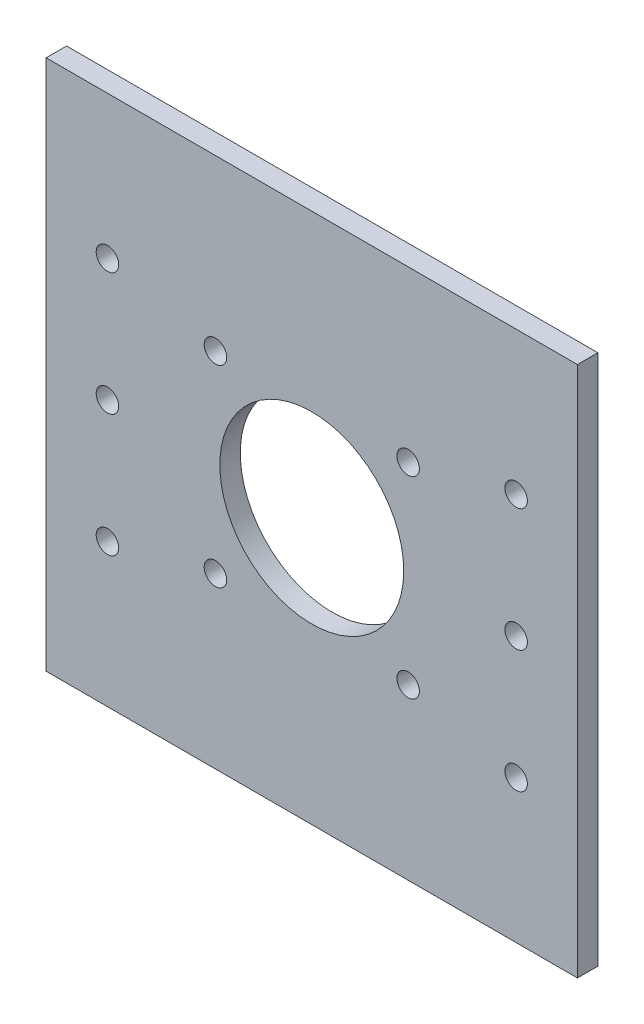
ISO-10303-21;
HEADER;
FILE_DESCRIPTION(('STEP AP214'),'2;1');
FILE_NAME('part.step','',(''),(''),'','','');
FILE_SCHEMA(('AUTOMOTIVE_DESIGN { 1 0 10303 214 1 1 1 1 }'));
ENDSEC;
DATA;
#1=APPLICATION_CONTEXT('core data for automotive mechanical design processes');
#2=APPLICATION_PROTOCOL_DEFINITION('international standard','automotive_design',2000,#1);
#3=PRODUCT_CONTEXT('',#1,'mechanical');
#4=PRODUCT('Part','Part','',(#3));
#5=PRODUCT_RELATED_PRODUCT_CATEGORY('part','',(#4));
#6=PRODUCT_DEFINITION_FORMATION('','',#4);
#7=PRODUCT_DEFINITION_CONTEXT('part definition',#1,'design');
#8=PRODUCT_DEFINITION('design','',#6,#7);
#9=PRODUCT_DEFINITION_SHAPE('','',#8);
#10=(LENGTH_UNIT() NAMED_UNIT(*) SI_UNIT(.MILLI.,.METRE.));
#11=(NAMED_UNIT(*) PLANE_ANGLE_UNIT() SI_UNIT($,.RADIAN.));
#12=(NAMED_UNIT(*) SI_UNIT($,.STERADIAN.) SOLID_ANGLE_UNIT());
#13=UNCERTAINTY_MEASURE_WITH_UNIT(LENGTH_MEASURE(1.E-05),#10,'distance_accuracy_value','');
#14=(GEOMETRIC_REPRESENTATION_CONTEXT(3) GLOBAL_UNCERTAINTY_ASSIGNED_CONTEXT((#13)) GLOBAL_UNIT_ASSIGNED_CONTEXT((#10,
#11,#12)) REPRESENTATION_CONTEXT('',''));
#15=CARTESIAN_POINT('',(0.,0.,0.));
#16=DIRECTION('',(0.,0.,1.));
#17=DIRECTION('',(1.,0.,0.));
#18=AXIS2_PLACEMENT_3D('',#15,#16,#17);
#19=CARTESIAN_POINT('',(0.,0.,5.));
#20=DIRECTION('',(0.,0.,1.));
#21=DIRECTION('',(1.,0.,0.));
#22=AXIS2_PLACEMENT_3D('',#19,#20,#21);
#23=PLANE('',#22);
#24=CARTESIAN_POINT('',(50.,0.,5.));
#25=DIRECTION('',(0.,0.,1.));
#26=DIRECTION('',(-1.,0.,0.));
#27=AXIS2_PLACEMENT_3D('',#24,#25,#26);
#28=CIRCLE('',#27,2.75);
#29=CARTESIAN_POINT('',(47.25,0.,5.));
#30=VERTEX_POINT('',#29);
#31=EDGE_CURVE('E197',#30,#30,#28,.T.);
#32=ORIENTED_EDGE('',*,*,#31,.F.);
#33=EDGE_LOOP('',(#32));
#34=FACE_BOUND('',#33,.T.);
#35=CARTESIAN_POINT('',(-50.,-30.,5.));
#36=DIRECTION('',(0.,0.,1.));
#37=DIRECTION('',(-1.,0.,0.));
#38=AXIS2_PLACEMENT_3D('',#35,#36,#37);
#39=CIRCLE('',#38,2.75);
#40=CARTESIAN_POINT('',(-52.75,-30.,5.));
#41=VERTEX_POINT('',#40);
#42=EDGE_CURVE('E181',#41,#41,#39,.T.);
#43=ORIENTED_EDGE('',*,*,#42,.F.);
#44=EDGE_LOOP('',(#43));
#45=FACE_BOUND('',#44,.T.);
#46=CARTESIAN_POINT('',(-50.,30.,5.));
#47=DIRECTION('',(0.,0.,1.));
#48=DIRECTION('',(1.,0.,0.));
#49=AXIS2_PLACEMENT_3D('',#46,#47,#48);
#50=CIRCLE('',#49,2.75);
#51=CARTESIAN_POINT('',(-47.25,30.,5.));
#52=VERTEX_POINT('',#51);
#53=EDGE_CURVE('E165',#52,#52,#50,.T.);
#54=ORIENTED_EDGE('',*,*,#53,.F.);
#55=EDGE_LOOP('',(#54));
#56=FACE_BOUND('',#55,.T.);
#57=CARTESIAN_POINT('',(23.5714045508536,-23.5714045508536,5.));
#58=DIRECTION('',(0.,0.,1.));
#59=DIRECTION('',(1.,0.,0.));
#60=AXIS2_PLACEMENT_3D('',#57,#58,#59);
#61=CIRCLE('',#60,2.74999999999999);
#62=CARTESIAN_POINT('',(26.3214045508536,-23.5714045508536,5.));
#63=VERTEX_POINT('',#62);
#64=EDGE_CURVE('E149',#63,#63,#61,.T.);
#65=ORIENTED_EDGE('',*,*,#64,.F.);
#66=EDGE_LOOP('',(#65));
#67=FACE_BOUND('',#66,.T.);
#68=CARTESIAN_POINT('',(-23.5714045508536,23.5714045508536,5.));
#69=DIRECTION('',(0.,0.,1.));
#70=DIRECTION('',(1.,0.,0.));
#71=AXIS2_PLACEMENT_3D('',#68,#69,#70);
#72=CIRCLE('',#71,2.75);
#73=CARTESIAN_POINT('',(-20.8214045508536,23.5714045508536,5.));
#74=VERTEX_POINT('',#73);
#75=EDGE_CURVE('E133',#74,#74,#72,.T.);
#76=ORIENTED_EDGE('',*,*,#75,.F.);
#77=EDGE_LOOP('',(#76));
#78=FACE_BOUND('',#77,.T.);
#79=DIRECTION('',(0.,-1.,0.));
#80=VECTOR('',#79,1.);
#81=CARTESIAN_POINT('',(-65.,-65.,5.));
#82=LINE('',#81,#80);
#83=CARTESIAN_POINT('',(-65.,65.,5.));
#84=VERTEX_POINT('',#83);
#85=CARTESIAN_POINT('',(-65.,-65.,5.));
#86=VERTEX_POINT('',#85);
#87=EDGE_CURVE('E91',#84,#86,#82,.T.);
#88=ORIENTED_EDGE('',*,*,#87,.T.);
#89=DIRECTION('',(1.,0.,0.));
#90=VECTOR('',#89,1.);
#91=CARTESIAN_POINT('',(65.,-65.,5.));
#92=LINE('',#91,#90);
#93=CARTESIAN_POINT('',(65.,-65.,5.));
#94=VERTEX_POINT('',#93);
#95=EDGE_CURVE('E86',#86,#94,#92,.T.);
#96=ORIENTED_EDGE('',*,*,#95,.T.);
#97=DIRECTION('',(0.,1.,0.));
#98=VECTOR('',#97,1.);
#99=CARTESIAN_POINT('',(65.,-65.,5.));
#100=LINE('',#99,#98);
#101=CARTESIAN_POINT('',(65.,65.,5.));
#102=VERTEX_POINT('',#101);
#103=EDGE_CURVE('E89',#94,#102,#100,.T.);
#104=ORIENTED_EDGE('',*,*,#103,.T.);
#105=DIRECTION('',(-1.,0.,0.));
#106=VECTOR('',#105,1.);
#107=CARTESIAN_POINT('',(65.,65.,5.));
#108=LINE('',#107,#106);
#109=EDGE_CURVE('E56',#102,#84,#108,.T.);
#110=ORIENTED_EDGE('',*,*,#109,.T.);
#111=EDGE_LOOP('',(#88,#96,#104,#110));
#112=FACE_BOUND('',#111,.T.);
#113=CARTESIAN_POINT('',(0.,0.,5.));
#114=DIRECTION('',(0.,0.,1.));
#115=DIRECTION('',(1.,0.,0.));
#116=AXIS2_PLACEMENT_3D('',#113,#114,#115);
#117=CIRCLE('',#116,22.5);
#118=CARTESIAN_POINT('',(22.5,0.,5.));
#119=VERTEX_POINT('',#118);
#120=EDGE_CURVE('E111',#119,#119,#117,.T.);
#121=ORIENTED_EDGE('',*,*,#120,.F.);
#122=EDGE_LOOP('',(#121));
#123=FACE_BOUND('',#122,.T.);
#124=CARTESIAN_POINT('',(23.5714045508536,23.5714045508536,5.));
#125=DIRECTION('',(0.,0.,1.));
#126=DIRECTION('',(1.,0.,0.));
#127=AXIS2_PLACEMENT_3D('',#124,#125,#126);
#128=CIRCLE('',#127,2.74999999999999);
#129=CARTESIAN_POINT('',(26.3214045508536,23.5714045508536,5.));
#130=VERTEX_POINT('',#129);
#131=EDGE_CURVE('E141',#130,#130,#128,.T.);
#132=ORIENTED_EDGE('',*,*,#131,.F.);
#133=EDGE_LOOP('',(#132));
#134=FACE_BOUND('',#133,.T.);
#135=CARTESIAN_POINT('',(-23.5714045508536,-23.5714045508536,5.));
#136=DIRECTION('',(0.,0.,1.));
#137=DIRECTION('',(1.,0.,0.));
#138=AXIS2_PLACEMENT_3D('',#135,#136,#137);
#139=CIRCLE('',#138,2.75);
#140=CARTESIAN_POINT('',(-20.8214045508536,-23.5714045508536,5.));
#141=VERTEX_POINT('',#140);
#142=EDGE_CURVE('E157',#141,#141,#139,.T.);
#143=ORIENTED_EDGE('',*,*,#142,.F.);
#144=EDGE_LOOP('',(#143));
#145=FACE_BOUND('',#144,.T.);
#146=CARTESIAN_POINT('',(-50.,0.,5.));
#147=DIRECTION('',(0.,0.,1.));
#148=DIRECTION('',(1.,0.,0.));
#149=AXIS2_PLACEMENT_3D('',#146,#147,#148);
#150=CIRCLE('',#149,2.75);
#151=CARTESIAN_POINT('',(-47.25,0.,5.));
#152=VERTEX_POINT('',#151);
#153=EDGE_CURVE('E173',#152,#152,#150,.T.);
#154=ORIENTED_EDGE('',*,*,#153,.F.);
#155=EDGE_LOOP('',(#154));
#156=FACE_BOUND('',#155,.T.);
#157=CARTESIAN_POINT('',(50.,-30.,5.));
#158=DIRECTION('',(0.,0.,1.));
#159=DIRECTION('',(1.,0.,0.));
#160=AXIS2_PLACEMENT_3D('',#157,#158,#159);
#161=CIRCLE('',#160,2.75);
#162=CARTESIAN_POINT('',(52.75,-30.,5.));
#163=VERTEX_POINT('',#162);
#164=EDGE_CURVE('E189',#163,#163,#161,.T.);
#165=ORIENTED_EDGE('',*,*,#164,.F.);
#166=EDGE_LOOP('',(#165));
#167=FACE_BOUND('',#166,.T.);
#168=CARTESIAN_POINT('',(50.,30.,5.));
#169=DIRECTION('',(0.,0.,1.));
#170=DIRECTION('',(-1.,0.,0.));
#171=AXIS2_PLACEMENT_3D('',#168,#169,#170);
#172=CIRCLE('',#171,2.75);
#173=CARTESIAN_POINT('',(47.25,30.,5.));
#174=VERTEX_POINT('',#173);
#175=EDGE_CURVE('E205',#174,#174,#172,.T.);
#176=ORIENTED_EDGE('',*,*,#175,.F.);
#177=EDGE_LOOP('',(#176));
#178=FACE_BOUND('',#177,.T.);
#179=ADVANCED_FACE('F38',(#34,#45,#56,#67,#78,#112,#123,#134,#145,#156,#167,#178),#23,.T.);
#180=CARTESIAN_POINT('',(0.,0.,0.));
#181=DIRECTION('',(0.,0.,1.));
#182=DIRECTION('',(1.,0.,0.));
#183=AXIS2_PLACEMENT_3D('',#180,#181,#182);
#184=PLANE('',#183);
#185=DIRECTION('',(0.,-1.,0.));
#186=VECTOR('',#185,1.);
#187=CARTESIAN_POINT('',(-65.,-65.,0.));
#188=LINE('',#187,#186);
#189=CARTESIAN_POINT('',(-65.,65.,0.));
#190=VERTEX_POINT('',#189);
#191=CARTESIAN_POINT('',(-65.,-65.,0.));
#192=VERTEX_POINT('',#191);
#193=EDGE_CURVE('E107',#190,#192,#188,.T.);
#194=ORIENTED_EDGE('',*,*,#193,.F.);
#195=DIRECTION('',(-1.,0.,0.));
#196=VECTOR('',#195,1.);
#197=CARTESIAN_POINT('',(65.,65.,0.));
#198=LINE('',#197,#196);
#199=CARTESIAN_POINT('',(65.,65.,0.));
#200=VERTEX_POINT('',#199);
#201=EDGE_CURVE('E79',#200,#190,#198,.T.);
#202=ORIENTED_EDGE('',*,*,#201,.F.);
#203=DIRECTION('',(0.,1.,0.));
#204=VECTOR('',#203,1.);
#205=CARTESIAN_POINT('',(65.,-65.,0.));
#206=LINE('',#205,#204);
#207=CARTESIAN_POINT('',(65.,-65.,0.));
#208=VERTEX_POINT('',#207);
#209=EDGE_CURVE('E73',#208,#200,#206,.T.);
#210=ORIENTED_EDGE('',*,*,#209,.F.);
#211=DIRECTION('',(1.,0.,0.));
#212=VECTOR('',#211,1.);
#213=CARTESIAN_POINT('',(65.,-65.,0.));
#214=LINE('',#213,#212);
#215=EDGE_CURVE('E96',#192,#208,#214,.T.);
#216=ORIENTED_EDGE('',*,*,#215,.F.);
#217=EDGE_LOOP('',(#194,#202,#210,#216));
#218=FACE_BOUND('',#217,.T.);
#219=CARTESIAN_POINT('',(0.,0.,0.));
#220=DIRECTION('',(0.,0.,1.));
#221=DIRECTION('',(1.,0.,0.));
#222=AXIS2_PLACEMENT_3D('',#219,#220,#221);
#223=CIRCLE('',#222,22.5);
#224=CARTESIAN_POINT('',(22.5,0.,0.));
#225=VERTEX_POINT('',#224);
#226=EDGE_CURVE('E129',#225,#225,#223,.T.);
#227=ORIENTED_EDGE('',*,*,#226,.T.);
#228=EDGE_LOOP('',(#227));
#229=FACE_BOUND('',#228,.T.);
#230=CARTESIAN_POINT('',(-23.5714045508536,23.5714045508536,0.));
#231=DIRECTION('',(0.,0.,1.));
#232=DIRECTION('',(1.,0.,0.));
#233=AXIS2_PLACEMENT_3D('',#230,#231,#232);
#234=CIRCLE('',#233,2.75);
#235=CARTESIAN_POINT('',(-20.8214045508536,23.5714045508536,0.));
#236=VERTEX_POINT('',#235);
#237=EDGE_CURVE('E137',#236,#236,#234,.T.);
#238=ORIENTED_EDGE('',*,*,#237,.T.);
#239=EDGE_LOOP('',(#238));
#240=FACE_BOUND('',#239,.T.);
#241=CARTESIAN_POINT('',(23.5714045508536,23.5714045508536,0.));
#242=DIRECTION('',(0.,0.,1.));
#243=DIRECTION('',(1.,0.,0.));
#244=AXIS2_PLACEMENT_3D('',#241,#242,#243);
#245=CIRCLE('',#244,2.74999999999999);
#246=CARTESIAN_POINT('',(26.3214045508536,23.5714045508536,0.));
#247=VERTEX_POINT('',#246);
#248=EDGE_CURVE('E145',#247,#247,#245,.T.);
#249=ORIENTED_EDGE('',*,*,#248,.T.);
#250=EDGE_LOOP('',(#249));
#251=FACE_BOUND('',#250,.T.);
#252=CARTESIAN_POINT('',(23.5714045508536,-23.5714045508536,0.));
#253=DIRECTION('',(0.,0.,1.));
#254=DIRECTION('',(1.,0.,0.));
#255=AXIS2_PLACEMENT_3D('',#252,#253,#254);
#256=CIRCLE('',#255,2.74999999999999);
#257=CARTESIAN_POINT('',(26.3214045508536,-23.5714045508536,0.));
#258=VERTEX_POINT('',#257);
#259=EDGE_CURVE('E153',#258,#258,#256,.T.);
#260=ORIENTED_EDGE('',*,*,#259,.T.);
#261=EDGE_LOOP('',(#260));
#262=FACE_BOUND('',#261,.T.);
#263=CARTESIAN_POINT('',(-23.5714045508536,-23.5714045508536,0.));
#264=DIRECTION('',(0.,0.,1.));
#265=DIRECTION('',(1.,0.,0.));
#266=AXIS2_PLACEMENT_3D('',#263,#264,#265);
#267=CIRCLE('',#266,2.75);
#268=CARTESIAN_POINT('',(-20.8214045508536,-23.5714045508536,0.));
#269=VERTEX_POINT('',#268);
#270=EDGE_CURVE('E161',#269,#269,#267,.T.);
#271=ORIENTED_EDGE('',*,*,#270,.T.);
#272=EDGE_LOOP('',(#271));
#273=FACE_BOUND('',#272,.T.);
#274=CARTESIAN_POINT('',(-50.,30.,0.));
#275=DIRECTION('',(0.,0.,1.));
#276=DIRECTION('',(1.,0.,0.));
#277=AXIS2_PLACEMENT_3D('',#274,#275,#276);
#278=CIRCLE('',#277,2.75);
#279=CARTESIAN_POINT('',(-47.25,30.,0.));
#280=VERTEX_POINT('',#279);
#281=EDGE_CURVE('E169',#280,#280,#278,.T.);
#282=ORIENTED_EDGE('',*,*,#281,.T.);
#283=EDGE_LOOP('',(#282));
#284=FACE_BOUND('',#283,.T.);
#285=CARTESIAN_POINT('',(-50.,0.,0.));
#286=DIRECTION('',(0.,0.,1.));
#287=DIRECTION('',(1.,0.,0.));
#288=AXIS2_PLACEMENT_3D('',#285,#286,#287);
#289=CIRCLE('',#288,2.75);
#290=CARTESIAN_POINT('',(-47.25,0.,0.));
#291=VERTEX_POINT('',#290);
#292=EDGE_CURVE('E177',#291,#291,#289,.T.);
#293=ORIENTED_EDGE('',*,*,#292,.T.);
#294=EDGE_LOOP('',(#293));
#295=FACE_BOUND('',#294,.T.);
#296=CARTESIAN_POINT('',(-50.,-30.,0.));
#297=DIRECTION('',(0.,0.,1.));
#298=DIRECTION('',(-1.,0.,0.));
#299=AXIS2_PLACEMENT_3D('',#296,#297,#298);
#300=CIRCLE('',#299,2.75);
#301=CARTESIAN_POINT('',(-52.75,-30.,0.));
#302=VERTEX_POINT('',#301);
#303=EDGE_CURVE('E185',#302,#302,#300,.T.);
#304=ORIENTED_EDGE('',*,*,#303,.T.);
#305=EDGE_LOOP('',(#304));
#306=FACE_BOUND('',#305,.T.);
#307=CARTESIAN_POINT('',(50.,-30.,0.));
#308=DIRECTION('',(0.,0.,1.));
#309=DIRECTION('',(1.,0.,0.));
#310=AXIS2_PLACEMENT_3D('',#307,#308,#309);
#311=CIRCLE('',#310,2.75);
#312=CARTESIAN_POINT('',(52.75,-30.,0.));
#313=VERTEX_POINT('',#312);
#314=EDGE_CURVE('E193',#313,#313,#311,.T.);
#315=ORIENTED_EDGE('',*,*,#314,.T.);
#316=EDGE_LOOP('',(#315));
#317=FACE_BOUND('',#316,.T.);
#318=CARTESIAN_POINT('',(50.,0.,0.));
#319=DIRECTION('',(0.,0.,1.));
#320=DIRECTION('',(-1.,0.,0.));
#321=AXIS2_PLACEMENT_3D('',#318,#319,#320);
#322=CIRCLE('',#321,2.75);
#323=CARTESIAN_POINT('',(47.25,0.,0.));
#324=VERTEX_POINT('',#323);
#325=EDGE_CURVE('E201',#324,#324,#322,.T.);
#326=ORIENTED_EDGE('',*,*,#325,.T.);
#327=EDGE_LOOP('',(#326));
#328=FACE_BOUND('',#327,.T.);
#329=CARTESIAN_POINT('',(50.,30.,0.));
#330=DIRECTION('',(0.,0.,1.));
#331=DIRECTION('',(-1.,0.,0.));
#332=AXIS2_PLACEMENT_3D('',#329,#330,#331);
#333=CIRCLE('',#332,2.75);
#334=CARTESIAN_POINT('',(47.25,30.,0.));
#335=VERTEX_POINT('',#334);
#336=EDGE_CURVE('E209',#335,#335,#333,.T.);
#337=ORIENTED_EDGE('',*,*,#336,.T.);
#338=EDGE_LOOP('',(#337));
#339=FACE_BOUND('',#338,.T.);
#340=ADVANCED_FACE('F124',(#218,#229,#240,#251,#262,#273,#284,#295,#306,#317,#328,#339),#184,.F.);
#341=CARTESIAN_POINT('',(-65.,-65.,5.));
#342=DIRECTION('',(1.,0.,0.));
#343=DIRECTION('',(0.,0.,-1.));
#344=AXIS2_PLACEMENT_3D('',#341,#342,#343);
#345=PLANE('',#344);
#346=ORIENTED_EDGE('',*,*,#193,.T.);
#347=DIRECTION('',(0.,0.,-1.));
#348=VECTOR('',#347,1.);
#349=CARTESIAN_POINT('',(-65.,-65.,5.));
#350=LINE('',#349,#348);
#351=EDGE_CURVE('E11',#86,#192,#350,.T.);
#352=ORIENTED_EDGE('',*,*,#351,.F.);
#353=ORIENTED_EDGE('',*,*,#87,.F.);
#354=DIRECTION('',(0.,0.,-1.));
#355=VECTOR('',#354,1.);
#356=CARTESIAN_POINT('',(-65.,65.,5.));
#357=LINE('',#356,#355);
#358=EDGE_CURVE('E103',#84,#190,#357,.T.);
#359=ORIENTED_EDGE('',*,*,#358,.T.);
#360=EDGE_LOOP('',(#346,#352,#353,#359));
#361=FACE_BOUND('',#360,.T.);
#362=ADVANCED_FACE('F40',(#361),#345,.F.);
#363=CARTESIAN_POINT('',(65.,-65.,5.));
#364=DIRECTION('',(0.,1.,0.));
#365=DIRECTION('',(0.,0.,1.));
#366=AXIS2_PLACEMENT_3D('',#363,#364,#365);
#367=PLANE('',#366);
#368=ORIENTED_EDGE('',*,*,#215,.T.);
#369=DIRECTION('',(0.,0.,-1.));
#370=VECTOR('',#369,1.);
#371=CARTESIAN_POINT('',(65.,-65.,5.));
#372=LINE('',#371,#370);
#373=EDGE_CURVE('E48',#94,#208,#372,.T.);
#374=ORIENTED_EDGE('',*,*,#373,.F.);
#375=ORIENTED_EDGE('',*,*,#95,.F.);
#376=ORIENTED_EDGE('',*,*,#351,.T.);
#377=EDGE_LOOP('',(#368,#374,#375,#376));
#378=FACE_BOUND('',#377,.T.);
#379=ADVANCED_FACE('F95',(#378),#367,.F.);
#380=CARTESIAN_POINT('',(65.,-65.,5.));
#381=DIRECTION('',(-1.,0.,0.));
#382=DIRECTION('',(0.,0.,1.));
#383=AXIS2_PLACEMENT_3D('',#380,#381,#382);
#384=PLANE('',#383);
#385=ORIENTED_EDGE('',*,*,#209,.T.);
#386=DIRECTION('',(0.,0.,-1.));
#387=VECTOR('',#386,1.);
#388=CARTESIAN_POINT('',(65.,65.,5.));
#389=LINE('',#388,#387);
#390=EDGE_CURVE('E98',#102,#200,#389,.T.);
#391=ORIENTED_EDGE('',*,*,#390,.F.);
#392=ORIENTED_EDGE('',*,*,#103,.F.);
#393=ORIENTED_EDGE('',*,*,#373,.T.);
#394=EDGE_LOOP('',(#385,#391,#392,#393));
#395=FACE_BOUND('',#394,.T.);
#396=ADVANCED_FACE('F99',(#395),#384,.F.);
#397=CARTESIAN_POINT('',(65.,65.,5.));
#398=DIRECTION('',(0.,-1.,0.));
#399=DIRECTION('',(1.,0.,0.));
#400=AXIS2_PLACEMENT_3D('',#397,#398,#399);
#401=PLANE('',#400);
#402=ORIENTED_EDGE('',*,*,#201,.T.);
#403=ORIENTED_EDGE('',*,*,#358,.F.);
#404=ORIENTED_EDGE('',*,*,#109,.F.);
#405=ORIENTED_EDGE('',*,*,#390,.T.);
#406=EDGE_LOOP('',(#402,#403,#404,#405));
#407=FACE_BOUND('',#406,.T.);
#408=ADVANCED_FACE('F121',(#407),#401,.F.);
#409=CARTESIAN_POINT('',(0.,0.,5.));
#410=DIRECTION('',(0.,0.,-1.));
#411=DIRECTION('',(-1.,0.,0.));
#412=AXIS2_PLACEMENT_3D('',#409,#410,#411);
#413=CYLINDRICAL_SURFACE('',#412,22.5);
#414=ORIENTED_EDGE('',*,*,#120,.T.);
#415=EDGE_LOOP('',(#414));
#416=FACE_BOUND('',#415,.T.);
#417=ORIENTED_EDGE('',*,*,#226,.F.);
#418=EDGE_LOOP('',(#417));
#419=FACE_BOUND('',#418,.T.);
#420=ADVANCED_FACE('F230',(#416,#419),#413,.F.);
#421=CARTESIAN_POINT('',(-23.5714045508536,23.5714045508536,5.));
#422=DIRECTION('',(0.,0.,-1.));
#423=DIRECTION('',(-1.,0.,0.));
#424=AXIS2_PLACEMENT_3D('',#421,#422,#423);
#425=CYLINDRICAL_SURFACE('',#424,2.75);
#426=ORIENTED_EDGE('',*,*,#75,.T.);
#427=EDGE_LOOP('',(#426));
#428=FACE_BOUND('',#427,.T.);
#429=ORIENTED_EDGE('',*,*,#237,.F.);
#430=EDGE_LOOP('',(#429));
#431=FACE_BOUND('',#430,.T.);
#432=ADVANCED_FACE('F276',(#428,#431),#425,.F.);
#433=CARTESIAN_POINT('',(23.5714045508536,23.5714045508536,5.));
#434=DIRECTION('',(0.,0.,-1.));
#435=DIRECTION('',(-1.,0.,0.));
#436=AXIS2_PLACEMENT_3D('',#433,#434,#435);
#437=CYLINDRICAL_SURFACE('',#436,2.74999999999999);
#438=ORIENTED_EDGE('',*,*,#131,.T.);
#439=EDGE_LOOP('',(#438));
#440=FACE_BOUND('',#439,.T.);
#441=ORIENTED_EDGE('',*,*,#248,.F.);
#442=EDGE_LOOP('',(#441));
#443=FACE_BOUND('',#442,.T.);
#444=ADVANCED_FACE('F284',(#440,#443),#437,.F.);
#445=CARTESIAN_POINT('',(23.5714045508536,-23.5714045508536,5.));
#446=DIRECTION('',(0.,0.,-1.));
#447=DIRECTION('',(-1.,0.,0.));
#448=AXIS2_PLACEMENT_3D('',#445,#446,#447);
#449=CYLINDRICAL_SURFACE('',#448,2.74999999999999);
#450=ORIENTED_EDGE('',*,*,#64,.T.);
#451=EDGE_LOOP('',(#450));
#452=FACE_BOUND('',#451,.T.);
#453=ORIENTED_EDGE('',*,*,#259,.F.);
#454=EDGE_LOOP('',(#453));
#455=FACE_BOUND('',#454,.T.);
#456=ADVANCED_FACE('F292',(#452,#455),#449,.F.);
#457=CARTESIAN_POINT('',(-23.5714045508536,-23.5714045508536,5.));
#458=DIRECTION('',(0.,0.,-1.));
#459=DIRECTION('',(-1.,0.,0.));
#460=AXIS2_PLACEMENT_3D('',#457,#458,#459);
#461=CYLINDRICAL_SURFACE('',#460,2.75);
#462=ORIENTED_EDGE('',*,*,#142,.T.);
#463=EDGE_LOOP('',(#462));
#464=FACE_BOUND('',#463,.T.);
#465=ORIENTED_EDGE('',*,*,#270,.F.);
#466=EDGE_LOOP('',(#465));
#467=FACE_BOUND('',#466,.T.);
#468=ADVANCED_FACE('F301',(#464,#467),#461,.F.);
#469=CARTESIAN_POINT('',(-50.,30.,5.));
#470=DIRECTION('',(0.,0.,-1.));
#471=DIRECTION('',(-1.,0.,0.));
#472=AXIS2_PLACEMENT_3D('',#469,#470,#471);
#473=CYLINDRICAL_SURFACE('',#472,2.75);
#474=ORIENTED_EDGE('',*,*,#53,.T.);
#475=EDGE_LOOP('',(#474));
#476=FACE_BOUND('',#475,.T.);
#477=ORIENTED_EDGE('',*,*,#281,.F.);
#478=EDGE_LOOP('',(#477));
#479=FACE_BOUND('',#478,.T.);
#480=ADVANCED_FACE('F310',(#476,#479),#473,.F.);
#481=CARTESIAN_POINT('',(-50.,0.,5.));
#482=DIRECTION('',(0.,0.,-1.));
#483=DIRECTION('',(-1.,0.,0.));
#484=AXIS2_PLACEMENT_3D('',#481,#482,#483);
#485=CYLINDRICAL_SURFACE('',#484,2.75);
#486=ORIENTED_EDGE('',*,*,#153,.T.);
#487=EDGE_LOOP('',(#486));
#488=FACE_BOUND('',#487,.T.);
#489=ORIENTED_EDGE('',*,*,#292,.F.);
#490=EDGE_LOOP('',(#489));
#491=FACE_BOUND('',#490,.T.);
#492=ADVANCED_FACE('F319',(#488,#491),#485,.F.);
#493=CARTESIAN_POINT('',(-50.,-30.,5.));
#494=DIRECTION('',(0.,0.,-1.));
#495=DIRECTION('',(-1.,0.,0.));
#496=AXIS2_PLACEMENT_3D('',#493,#494,#495);
#497=CYLINDRICAL_SURFACE('',#496,2.75);
#498=ORIENTED_EDGE('',*,*,#42,.T.);
#499=EDGE_LOOP('',(#498));
#500=FACE_BOUND('',#499,.T.);
#501=ORIENTED_EDGE('',*,*,#303,.F.);
#502=EDGE_LOOP('',(#501));
#503=FACE_BOUND('',#502,.T.);
#504=ADVANCED_FACE('F328',(#500,#503),#497,.F.);
#505=CARTESIAN_POINT('',(50.,-30.,5.));
#506=DIRECTION('',(0.,0.,-1.));
#507=DIRECTION('',(-1.,0.,0.));
#508=AXIS2_PLACEMENT_3D('',#505,#506,#507);
#509=CYLINDRICAL_SURFACE('',#508,2.75);
#510=ORIENTED_EDGE('',*,*,#164,.T.);
#511=EDGE_LOOP('',(#510));
#512=FACE_BOUND('',#511,.T.);
#513=ORIENTED_EDGE('',*,*,#314,.F.);
#514=EDGE_LOOP('',(#513));
#515=FACE_BOUND('',#514,.T.);
#516=ADVANCED_FACE('F337',(#512,#515),#509,.F.);
#517=CARTESIAN_POINT('',(50.,0.,5.));
#518=DIRECTION('',(0.,0.,-1.));
#519=DIRECTION('',(-1.,0.,0.));
#520=AXIS2_PLACEMENT_3D('',#517,#518,#519);
#521=CYLINDRICAL_SURFACE('',#520,2.75);
#522=ORIENTED_EDGE('',*,*,#31,.T.);
#523=EDGE_LOOP('',(#522));
#524=FACE_BOUND('',#523,.T.);
#525=ORIENTED_EDGE('',*,*,#325,.F.);
#526=EDGE_LOOP('',(#525));
#527=FACE_BOUND('',#526,.T.);
#528=ADVANCED_FACE('F346',(#524,#527),#521,.F.);
#529=CARTESIAN_POINT('',(50.,30.,5.));
#530=DIRECTION('',(0.,0.,-1.));
#531=DIRECTION('',(-1.,0.,0.));
#532=AXIS2_PLACEMENT_3D('',#529,#530,#531);
#533=CYLINDRICAL_SURFACE('',#532,2.75);
#534=ORIENTED_EDGE('',*,*,#175,.T.);
#535=EDGE_LOOP('',(#534));
#536=FACE_BOUND('',#535,.T.);
#537=ORIENTED_EDGE('',*,*,#336,.F.);
#538=EDGE_LOOP('',(#537));
#539=FACE_BOUND('',#538,.T.);
#540=ADVANCED_FACE('F217',(#536,#539),#533,.F.);
#541=CLOSED_SHELL('',(#179,#340,#362,#379,#396,#408,#420,#432,#444,#456,#468,#480,#492,#504,
#516,#528,#540));
#542=MANIFOLD_SOLID_BREP('B2',#541);
#543=ADVANCED_BREP_SHAPE_REPRESENTATION('',(#18,#542),#14);
#544=SHAPE_DEFINITION_REPRESENTATION(#9,#543);
ENDSEC;
END-ISO-10303-21;
